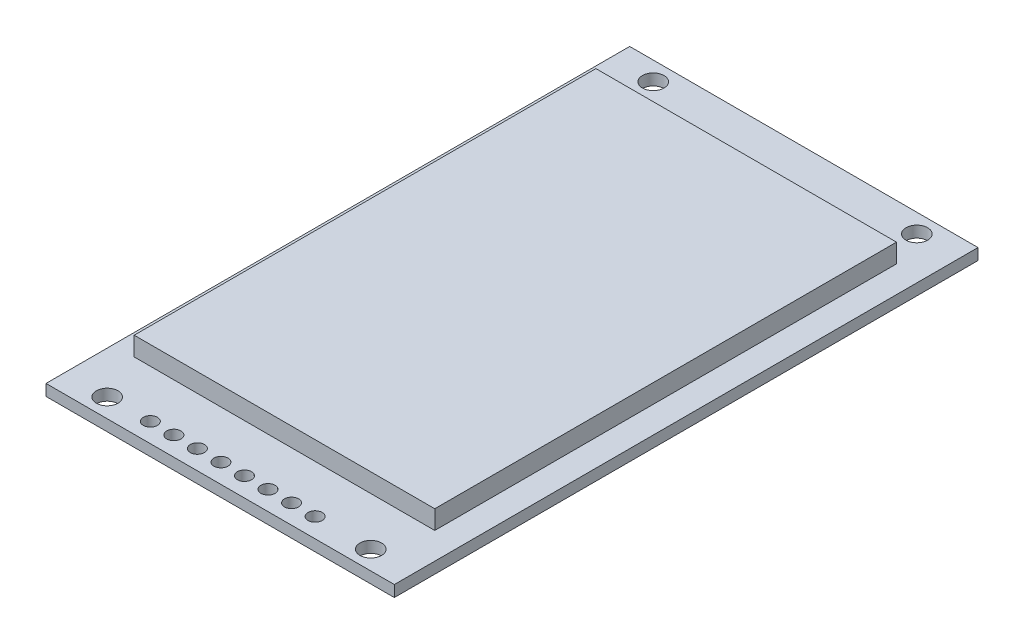
ISO-10303-21;
HEADER;
FILE_DESCRIPTION(('STEP AP214'),'2;1');
FILE_NAME('part.step','',(''),(''),'','','');
FILE_SCHEMA(('AUTOMOTIVE_DESIGN { 1 0 10303 214 1 1 1 1 }'));
ENDSEC;
DATA;
#1=APPLICATION_CONTEXT('core data for automotive mechanical design processes');
#2=APPLICATION_PROTOCOL_DEFINITION('international standard','automotive_design',2000,#1);
#3=PRODUCT_CONTEXT('',#1,'mechanical');
#4=PRODUCT('Part','Part','',(#3));
#5=PRODUCT_RELATED_PRODUCT_CATEGORY('part','',(#4));
#6=PRODUCT_DEFINITION_FORMATION('','',#4);
#7=PRODUCT_DEFINITION_CONTEXT('part definition',#1,'design');
#8=PRODUCT_DEFINITION('design','',#6,#7);
#9=PRODUCT_DEFINITION_SHAPE('','',#8);
#10=(LENGTH_UNIT() NAMED_UNIT(*) SI_UNIT(.MILLI.,.METRE.));
#11=(NAMED_UNIT(*) PLANE_ANGLE_UNIT() SI_UNIT($,.RADIAN.));
#12=(NAMED_UNIT(*) SI_UNIT($,.STERADIAN.) SOLID_ANGLE_UNIT());
#13=UNCERTAINTY_MEASURE_WITH_UNIT(LENGTH_MEASURE(1.E-05),#10,'distance_accuracy_value','');
#14=(GEOMETRIC_REPRESENTATION_CONTEXT(3) GLOBAL_UNCERTAINTY_ASSIGNED_CONTEXT((#13)) GLOBAL_UNIT_ASSIGNED_CONTEXT((#10,
#11,#12)) REPRESENTATION_CONTEXT('',''));
#15=CARTESIAN_POINT('',(0.,0.,0.));
#16=DIRECTION('',(0.,0.,1.));
#17=DIRECTION('',(1.,0.,0.));
#18=AXIS2_PLACEMENT_3D('',#15,#16,#17);
#19=CARTESIAN_POINT('',(0.,1.2,0.));
#20=DIRECTION('',(0.,-1.,0.));
#21=DIRECTION('',(0.,0.,-1.));
#22=AXIS2_PLACEMENT_3D('',#19,#20,#21);
#23=PLANE('',#22);
#24=CARTESIAN_POINT('',(9.03157835822631,1.2,-2.0506883751099));
#25=DIRECTION('',(0.,1.,0.));
#26=DIRECTION('',(0.,0.,1.));
#27=AXIS2_PLACEMENT_3D('',#24,#25,#26);
#28=CIRCLE('',#27,0.75);
#29=CARTESIAN_POINT('',(9.03157835822631,1.2,-1.3006883751099));
#30=VERTEX_POINT('',#29);
#31=EDGE_CURVE('E297',#30,#30,#28,.T.);
#32=ORIENTED_EDGE('',*,*,#31,.F.);
#33=EDGE_LOOP('',(#32));
#34=FACE_BOUND('',#33,.T.);
#35=CARTESIAN_POINT('',(11.5315783582263,1.2,-2.0506883751099));
#36=DIRECTION('',(0.,1.,0.));
#37=DIRECTION('',(0.,0.,1.));
#38=AXIS2_PLACEMENT_3D('',#35,#36,#37);
#39=CIRCLE('',#38,0.75);
#40=CARTESIAN_POINT('',(11.5315783582263,1.2,-1.3006883751099));
#41=VERTEX_POINT('',#40);
#42=EDGE_CURVE('E298',#41,#41,#39,.T.);
#43=ORIENTED_EDGE('',*,*,#42,.F.);
#44=EDGE_LOOP('',(#43));
#45=FACE_BOUND('',#44,.T.);
#46=CARTESIAN_POINT('',(14.0315783582263,1.2,-2.0506883751099));
#47=DIRECTION('',(0.,1.,0.));
#48=DIRECTION('',(0.,0.,1.));
#49=AXIS2_PLACEMENT_3D('',#46,#47,#48);
#50=CIRCLE('',#49,0.749999999999999);
#51=CARTESIAN_POINT('',(14.0315783582263,1.2,-1.30068837510991));
#52=VERTEX_POINT('',#51);
#53=EDGE_CURVE('E307',#52,#52,#50,.T.);
#54=ORIENTED_EDGE('',*,*,#53,.F.);
#55=EDGE_LOOP('',(#54));
#56=FACE_BOUND('',#55,.T.);
#57=CARTESIAN_POINT('',(16.5315783582263,1.2,-2.0506883751099));
#58=DIRECTION('',(0.,1.,0.));
#59=DIRECTION('',(0.,0.,1.));
#60=AXIS2_PLACEMENT_3D('',#57,#58,#59);
#61=CIRCLE('',#60,0.749999999999999);
#62=CARTESIAN_POINT('',(16.5315783582263,1.2,-1.30068837510991));
#63=VERTEX_POINT('',#62);
#64=EDGE_CURVE('E313',#63,#63,#61,.T.);
#65=ORIENTED_EDGE('',*,*,#64,.F.);
#66=EDGE_LOOP('',(#65));
#67=FACE_BOUND('',#66,.T.);
#68=CARTESIAN_POINT('',(19.0315783582263,1.2,-2.0506883751099));
#69=DIRECTION('',(0.,1.,0.));
#70=DIRECTION('',(0.,0.,1.));
#71=AXIS2_PLACEMENT_3D('',#68,#69,#70);
#72=CIRCLE('',#71,0.749999999999999);
#73=CARTESIAN_POINT('',(19.0315783582263,1.2,-1.30068837510991));
#74=VERTEX_POINT('',#73);
#75=EDGE_CURVE('E319',#74,#74,#72,.T.);
#76=ORIENTED_EDGE('',*,*,#75,.F.);
#77=EDGE_LOOP('',(#76));
#78=FACE_BOUND('',#77,.T.);
#79=CARTESIAN_POINT('',(21.5315783582263,1.2,-2.0506883751099));
#80=DIRECTION('',(0.,1.,0.));
#81=DIRECTION('',(0.,0.,1.));
#82=AXIS2_PLACEMENT_3D('',#79,#80,#81);
#83=CIRCLE('',#82,0.750000000000002);
#84=CARTESIAN_POINT('',(21.5315783582263,1.2,-1.3006883751099));
#85=VERTEX_POINT('',#84);
#86=EDGE_CURVE('E325',#85,#85,#83,.T.);
#87=ORIENTED_EDGE('',*,*,#86,.F.);
#88=EDGE_LOOP('',(#87));
#89=FACE_BOUND('',#88,.T.);
#90=CARTESIAN_POINT('',(24.0315783582263,1.2,-2.0506883751099));
#91=DIRECTION('',(0.,1.,0.));
#92=DIRECTION('',(0.,0.,1.));
#93=AXIS2_PLACEMENT_3D('',#90,#91,#92);
#94=CIRCLE('',#93,0.749999999999999);
#95=CARTESIAN_POINT('',(24.0315783582263,1.2,-1.30068837510991));
#96=VERTEX_POINT('',#95);
#97=EDGE_CURVE('E331',#96,#96,#94,.T.);
#98=ORIENTED_EDGE('',*,*,#97,.F.);
#99=EDGE_LOOP('',(#98));
#100=FACE_BOUND('',#99,.T.);
#101=CARTESIAN_POINT('',(26.5315783582263,1.2,-2.0506883751099));
#102=DIRECTION('',(0.,1.,0.));
#103=DIRECTION('',(0.,0.,1.));
#104=AXIS2_PLACEMENT_3D('',#101,#102,#103);
#105=CIRCLE('',#104,0.749999999999999);
#106=CARTESIAN_POINT('',(26.5315783582263,1.2,-1.30068837510991));
#107=VERTEX_POINT('',#106);
#108=EDGE_CURVE('E337',#107,#107,#105,.T.);
#109=ORIENTED_EDGE('',*,*,#108,.F.);
#110=EDGE_LOOP('',(#109));
#111=FACE_BOUND('',#110,.T.);
#112=CARTESIAN_POINT('',(4.50000000000001,1.2,-2.));
#113=DIRECTION('',(0.,1.,0.));
#114=DIRECTION('',(0.,0.,1.));
#115=AXIS2_PLACEMENT_3D('',#112,#113,#114);
#116=CIRCLE('',#115,1.15);
#117=CARTESIAN_POINT('',(4.50000000000001,1.2,-0.850000000000006));
#118=VERTEX_POINT('',#117);
#119=EDGE_CURVE('E127',#118,#118,#116,.T.);
#120=ORIENTED_EDGE('',*,*,#119,.F.);
#121=EDGE_LOOP('',(#120));
#122=FACE_BOUND('',#121,.T.);
#123=CARTESIAN_POINT('',(32.5,1.2,-2.00000000000001));
#124=DIRECTION('',(0.,1.,0.));
#125=DIRECTION('',(0.,0.,1.));
#126=AXIS2_PLACEMENT_3D('',#123,#124,#125);
#127=CIRCLE('',#126,1.15);
#128=CARTESIAN_POINT('',(32.5,1.2,-0.850000000000013));
#129=VERTEX_POINT('',#128);
#130=EDGE_CURVE('E136',#129,#129,#127,.T.);
#131=ORIENTED_EDGE('',*,*,#130,.F.);
#132=EDGE_LOOP('',(#131));
#133=FACE_BOUND('',#132,.T.);
#134=CARTESIAN_POINT('',(4.49999999999999,1.2,-60.));
#135=DIRECTION('',(0.,1.,0.));
#136=DIRECTION('',(0.,0.,1.));
#137=AXIS2_PLACEMENT_3D('',#134,#135,#136);
#138=CIRCLE('',#137,1.15);
#139=CARTESIAN_POINT('',(4.49999999999999,1.2,-58.85));
#140=VERTEX_POINT('',#139);
#141=EDGE_CURVE('E142',#140,#140,#138,.T.);
#142=ORIENTED_EDGE('',*,*,#141,.F.);
#143=EDGE_LOOP('',(#142));
#144=FACE_BOUND('',#143,.T.);
#145=CARTESIAN_POINT('',(32.5,1.2,-60.));
#146=DIRECTION('',(0.,1.,0.));
#147=DIRECTION('',(0.,0.,1.));
#148=AXIS2_PLACEMENT_3D('',#145,#146,#147);
#149=CIRCLE('',#148,1.15);
#150=CARTESIAN_POINT('',(32.5,1.2,-58.85));
#151=VERTEX_POINT('',#150);
#152=EDGE_CURVE('E148',#151,#151,#149,.T.);
#153=ORIENTED_EDGE('',*,*,#152,.F.);
#154=EDGE_LOOP('',(#153));
#155=FACE_BOUND('',#154,.T.);
#156=DIRECTION('',(0.,0.,1.));
#157=VECTOR('',#156,1.);
#158=CARTESIAN_POINT('',(0.,1.2,0.));
#159=LINE('',#158,#157);
#160=CARTESIAN_POINT('',(0.,1.2,-62.));
#161=VERTEX_POINT('',#160);
#162=CARTESIAN_POINT('',(0.,1.2,0.));
#163=VERTEX_POINT('',#162);
#164=EDGE_CURVE('E154',#161,#163,#159,.T.);
#165=ORIENTED_EDGE('',*,*,#164,.T.);
#166=DIRECTION('',(1.,0.,0.));
#167=VECTOR('',#166,1.);
#168=CARTESIAN_POINT('',(0.,1.2,0.));
#169=LINE('',#168,#167);
#170=CARTESIAN_POINT('',(37.,1.2,0.));
#171=VERTEX_POINT('',#170);
#172=EDGE_CURVE('E157',#163,#171,#169,.T.);
#173=ORIENTED_EDGE('',*,*,#172,.T.);
#174=DIRECTION('',(0.,0.,-1.));
#175=VECTOR('',#174,1.);
#176=CARTESIAN_POINT('',(37.,1.2,0.));
#177=LINE('',#176,#175);
#178=CARTESIAN_POINT('',(37.,1.2,-62.));
#179=VERTEX_POINT('',#178);
#180=EDGE_CURVE('E160',#171,#179,#177,.T.);
#181=ORIENTED_EDGE('',*,*,#180,.T.);
#182=DIRECTION('',(-1.,0.,0.));
#183=VECTOR('',#182,1.);
#184=CARTESIAN_POINT('',(0.,1.2,-62.));
#185=LINE('',#184,#183);
#186=EDGE_CURVE('E162',#179,#161,#185,.T.);
#187=ORIENTED_EDGE('',*,*,#186,.T.);
#188=EDGE_LOOP('',(#165,#173,#181,#187));
#189=FACE_BOUND('',#188,.T.);
#190=DIRECTION('',(0.,0.,1.));
#191=VECTOR('',#190,1.);
#192=CARTESIAN_POINT('',(2.24617057200364,1.2,-56.1673902356273));
#193=LINE('',#192,#191);
#194=CARTESIAN_POINT('',(2.24617057200364,1.2,-56.1673902356273));
#195=VERTEX_POINT('',#194);
#196=CARTESIAN_POINT('',(2.24617057200364,1.2,-7.12049327323211));
#197=VERTEX_POINT('',#196);
#198=EDGE_CURVE('E54',#195,#197,#193,.T.);
#199=ORIENTED_EDGE('',*,*,#198,.F.);
#200=DIRECTION('',(-1.,0.,0.));
#201=VECTOR('',#200,1.);
#202=CARTESIAN_POINT('',(2.24617057200364,1.2,-56.1673902356273));
#203=LINE('',#202,#201);
#204=CARTESIAN_POINT('',(34.1749492291427,1.2,-56.1673902356273));
#205=VERTEX_POINT('',#204);
#206=EDGE_CURVE('E58',#205,#195,#203,.T.);
#207=ORIENTED_EDGE('',*,*,#206,.F.);
#208=DIRECTION('',(0.,0.,-1.));
#209=VECTOR('',#208,1.);
#210=CARTESIAN_POINT('',(34.1749492291427,1.2,-56.1673902356273));
#211=LINE('',#210,#209);
#212=CARTESIAN_POINT('',(34.1749492291427,1.2,-7.12049327323211));
#213=VERTEX_POINT('',#212);
#214=EDGE_CURVE('E349',#213,#205,#211,.T.);
#215=ORIENTED_EDGE('',*,*,#214,.F.);
#216=DIRECTION('',(1.,0.,0.));
#217=VECTOR('',#216,1.);
#218=CARTESIAN_POINT('',(2.24617057200364,1.2,-7.12049327323211));
#219=LINE('',#218,#217);
#220=EDGE_CURVE('E347',#197,#213,#219,.T.);
#221=ORIENTED_EDGE('',*,*,#220,.F.);
#222=EDGE_LOOP('',(#199,#207,#215,#221));
#223=FACE_BOUND('',#222,.T.);
#224=ADVANCED_FACE('F39',(#34,#45,#56,#67,#78,#89,#100,#111,#122,#133,#144,#155,#189,#223),#23,.F.);
#225=CARTESIAN_POINT('',(0.,0.,0.));
#226=DIRECTION('',(0.,-1.,0.));
#227=DIRECTION('',(0.,0.,-1.));
#228=AXIS2_PLACEMENT_3D('',#225,#226,#227);
#229=PLANE('',#228);
#230=CARTESIAN_POINT('',(9.03157835822631,0.,-2.0506883751099));
#231=DIRECTION('',(0.,1.,0.));
#232=DIRECTION('',(0.,0.,1.));
#233=AXIS2_PLACEMENT_3D('',#230,#231,#232);
#234=CIRCLE('',#233,0.75);
#235=CARTESIAN_POINT('',(9.03157835822631,0.,-1.3006883751099));
#236=VERTEX_POINT('',#235);
#237=EDGE_CURVE('E295',#236,#236,#234,.T.);
#238=ORIENTED_EDGE('',*,*,#237,.T.);
#239=EDGE_LOOP('',(#238));
#240=FACE_BOUND('',#239,.T.);
#241=CARTESIAN_POINT('',(11.5315783582263,0.,-2.0506883751099));
#242=DIRECTION('',(0.,1.,0.));
#243=DIRECTION('',(0.,0.,1.));
#244=AXIS2_PLACEMENT_3D('',#241,#242,#243);
#245=CIRCLE('',#244,0.75);
#246=CARTESIAN_POINT('',(11.5315783582263,0.,-1.3006883751099));
#247=VERTEX_POINT('',#246);
#248=EDGE_CURVE('E302',#247,#247,#245,.T.);
#249=ORIENTED_EDGE('',*,*,#248,.T.);
#250=EDGE_LOOP('',(#249));
#251=FACE_BOUND('',#250,.T.);
#252=CARTESIAN_POINT('',(14.0315783582263,0.,-2.0506883751099));
#253=DIRECTION('',(0.,1.,0.));
#254=DIRECTION('',(0.,0.,1.));
#255=AXIS2_PLACEMENT_3D('',#252,#253,#254);
#256=CIRCLE('',#255,0.749999999999999);
#257=CARTESIAN_POINT('',(14.0315783582263,0.,-1.30068837510991));
#258=VERTEX_POINT('',#257);
#259=EDGE_CURVE('E310',#258,#258,#256,.T.);
#260=ORIENTED_EDGE('',*,*,#259,.T.);
#261=EDGE_LOOP('',(#260));
#262=FACE_BOUND('',#261,.T.);
#263=CARTESIAN_POINT('',(16.5315783582263,0.,-2.0506883751099));
#264=DIRECTION('',(0.,1.,0.));
#265=DIRECTION('',(0.,0.,1.));
#266=AXIS2_PLACEMENT_3D('',#263,#264,#265);
#267=CIRCLE('',#266,0.749999999999999);
#268=CARTESIAN_POINT('',(16.5315783582263,0.,-1.30068837510991));
#269=VERTEX_POINT('',#268);
#270=EDGE_CURVE('E316',#269,#269,#267,.T.);
#271=ORIENTED_EDGE('',*,*,#270,.T.);
#272=EDGE_LOOP('',(#271));
#273=FACE_BOUND('',#272,.T.);
#274=CARTESIAN_POINT('',(19.0315783582263,0.,-2.0506883751099));
#275=DIRECTION('',(0.,1.,0.));
#276=DIRECTION('',(0.,0.,1.));
#277=AXIS2_PLACEMENT_3D('',#274,#275,#276);
#278=CIRCLE('',#277,0.749999999999999);
#279=CARTESIAN_POINT('',(19.0315783582263,0.,-1.30068837510991));
#280=VERTEX_POINT('',#279);
#281=EDGE_CURVE('E322',#280,#280,#278,.T.);
#282=ORIENTED_EDGE('',*,*,#281,.T.);
#283=EDGE_LOOP('',(#282));
#284=FACE_BOUND('',#283,.T.);
#285=CARTESIAN_POINT('',(21.5315783582263,0.,-2.0506883751099));
#286=DIRECTION('',(0.,1.,0.));
#287=DIRECTION('',(0.,0.,1.));
#288=AXIS2_PLACEMENT_3D('',#285,#286,#287);
#289=CIRCLE('',#288,0.750000000000002);
#290=CARTESIAN_POINT('',(21.5315783582263,0.,-1.3006883751099));
#291=VERTEX_POINT('',#290);
#292=EDGE_CURVE('E328',#291,#291,#289,.T.);
#293=ORIENTED_EDGE('',*,*,#292,.T.);
#294=EDGE_LOOP('',(#293));
#295=FACE_BOUND('',#294,.T.);
#296=CARTESIAN_POINT('',(24.0315783582263,0.,-2.0506883751099));
#297=DIRECTION('',(0.,1.,0.));
#298=DIRECTION('',(0.,0.,1.));
#299=AXIS2_PLACEMENT_3D('',#296,#297,#298);
#300=CIRCLE('',#299,0.749999999999999);
#301=CARTESIAN_POINT('',(24.0315783582263,0.,-1.30068837510991));
#302=VERTEX_POINT('',#301);
#303=EDGE_CURVE('E334',#302,#302,#300,.T.);
#304=ORIENTED_EDGE('',*,*,#303,.T.);
#305=EDGE_LOOP('',(#304));
#306=FACE_BOUND('',#305,.T.);
#307=CARTESIAN_POINT('',(26.5315783582263,0.,-2.0506883751099));
#308=DIRECTION('',(0.,1.,0.));
#309=DIRECTION('',(0.,0.,1.));
#310=AXIS2_PLACEMENT_3D('',#307,#308,#309);
#311=CIRCLE('',#310,0.749999999999999);
#312=CARTESIAN_POINT('',(26.5315783582263,0.,-1.30068837510991));
#313=VERTEX_POINT('',#312);
#314=EDGE_CURVE('E340',#313,#313,#311,.T.);
#315=ORIENTED_EDGE('',*,*,#314,.T.);
#316=EDGE_LOOP('',(#315));
#317=FACE_BOUND('',#316,.T.);
#318=CARTESIAN_POINT('',(32.5,0.,-2.00000000000001));
#319=DIRECTION('',(0.,1.,0.));
#320=DIRECTION('',(0.,0.,1.));
#321=AXIS2_PLACEMENT_3D('',#318,#319,#320);
#322=CIRCLE('',#321,1.15);
#323=CARTESIAN_POINT('',(32.5,0.,-0.850000000000013));
#324=VERTEX_POINT('',#323);
#325=EDGE_CURVE('E134',#324,#324,#322,.T.);
#326=ORIENTED_EDGE('',*,*,#325,.T.);
#327=EDGE_LOOP('',(#326));
#328=FACE_BOUND('',#327,.T.);
#329=CARTESIAN_POINT('',(32.5,0.,-60.));
#330=DIRECTION('',(0.,1.,0.));
#331=DIRECTION('',(0.,0.,1.));
#332=AXIS2_PLACEMENT_3D('',#329,#330,#331);
#333=CIRCLE('',#332,1.15);
#334=CARTESIAN_POINT('',(32.5,0.,-58.85));
#335=VERTEX_POINT('',#334);
#336=EDGE_CURVE('E145',#335,#335,#333,.T.);
#337=ORIENTED_EDGE('',*,*,#336,.T.);
#338=EDGE_LOOP('',(#337));
#339=FACE_BOUND('',#338,.T.);
#340=DIRECTION('',(0.,0.,1.));
#341=VECTOR('',#340,1.);
#342=CARTESIAN_POINT('',(0.,0.,0.));
#343=LINE('',#342,#341);
#344=CARTESIAN_POINT('',(0.,0.,-62.));
#345=VERTEX_POINT('',#344);
#346=CARTESIAN_POINT('',(0.,0.,0.));
#347=VERTEX_POINT('',#346);
#348=EDGE_CURVE('E151',#345,#347,#343,.T.);
#349=ORIENTED_EDGE('',*,*,#348,.F.);
#350=DIRECTION('',(-1.,0.,0.));
#351=VECTOR('',#350,1.);
#352=CARTESIAN_POINT('',(0.,0.,-62.));
#353=LINE('',#352,#351);
#354=CARTESIAN_POINT('',(37.,0.,-62.));
#355=VERTEX_POINT('',#354);
#356=EDGE_CURVE('E158',#355,#345,#353,.T.);
#357=ORIENTED_EDGE('',*,*,#356,.F.);
#358=DIRECTION('',(0.,0.,-1.));
#359=VECTOR('',#358,1.);
#360=CARTESIAN_POINT('',(37.,0.,0.));
#361=LINE('',#360,#359);
#362=CARTESIAN_POINT('',(37.,0.,0.));
#363=VERTEX_POINT('',#362);
#364=EDGE_CURVE('E169',#363,#355,#361,.T.);
#365=ORIENTED_EDGE('',*,*,#364,.F.);
#366=DIRECTION('',(1.,0.,0.));
#367=VECTOR('',#366,1.);
#368=CARTESIAN_POINT('',(0.,0.,0.));
#369=LINE('',#368,#367);
#370=EDGE_CURVE('E167',#347,#363,#369,.T.);
#371=ORIENTED_EDGE('',*,*,#370,.F.);
#372=EDGE_LOOP('',(#349,#357,#365,#371));
#373=FACE_BOUND('',#372,.T.);
#374=CARTESIAN_POINT('',(4.49999999999999,0.,-60.));
#375=DIRECTION('',(0.,1.,0.));
#376=DIRECTION('',(0.,0.,1.));
#377=AXIS2_PLACEMENT_3D('',#374,#375,#376);
#378=CIRCLE('',#377,1.15);
#379=CARTESIAN_POINT('',(4.49999999999999,0.,-58.85));
#380=VERTEX_POINT('',#379);
#381=EDGE_CURVE('E139',#380,#380,#378,.T.);
#382=ORIENTED_EDGE('',*,*,#381,.T.);
#383=EDGE_LOOP('',(#382));
#384=FACE_BOUND('',#383,.T.);
#385=CARTESIAN_POINT('',(4.50000000000001,0.,-2.));
#386=DIRECTION('',(0.,1.,0.));
#387=DIRECTION('',(0.,0.,1.));
#388=AXIS2_PLACEMENT_3D('',#385,#386,#387);
#389=CIRCLE('',#388,1.15);
#390=CARTESIAN_POINT('',(4.50000000000001,0.,-0.850000000000006));
#391=VERTEX_POINT('',#390);
#392=EDGE_CURVE('E124',#391,#391,#389,.T.);
#393=ORIENTED_EDGE('',*,*,#392,.T.);
#394=EDGE_LOOP('',(#393));
#395=FACE_BOUND('',#394,.T.);
#396=ADVANCED_FACE('F187',(#240,#251,#262,#273,#284,#295,#306,#317,#328,#339,#373,#384,#395),
#229,.T.);
#397=CARTESIAN_POINT('',(0.,1.2,0.));
#398=DIRECTION('',(1.,0.,0.));
#399=DIRECTION('',(0.,0.,-1.));
#400=AXIS2_PLACEMENT_3D('',#397,#398,#399);
#401=PLANE('',#400);
#402=ORIENTED_EDGE('',*,*,#348,.T.);
#403=DIRECTION('',(0.,-1.,0.));
#404=VECTOR('',#403,1.);
#405=CARTESIAN_POINT('',(0.,1.2,0.));
#406=LINE('',#405,#404);
#407=EDGE_CURVE('E11',#163,#347,#406,.T.);
#408=ORIENTED_EDGE('',*,*,#407,.F.);
#409=ORIENTED_EDGE('',*,*,#164,.F.);
#410=DIRECTION('',(0.,-1.,0.));
#411=VECTOR('',#410,1.);
#412=CARTESIAN_POINT('',(0.,1.2,-62.));
#413=LINE('',#412,#411);
#414=EDGE_CURVE('E164',#161,#345,#413,.T.);
#415=ORIENTED_EDGE('',*,*,#414,.T.);
#416=EDGE_LOOP('',(#402,#408,#409,#415));
#417=FACE_BOUND('',#416,.T.);
#418=ADVANCED_FACE('F41',(#417),#401,.F.);
#419=CARTESIAN_POINT('',(0.,1.2,0.));
#420=DIRECTION('',(0.,0.,-1.));
#421=DIRECTION('',(-1.,0.,0.));
#422=AXIS2_PLACEMENT_3D('',#419,#420,#421);
#423=PLANE('',#422);
#424=ORIENTED_EDGE('',*,*,#370,.T.);
#425=DIRECTION('',(0.,-1.,0.));
#426=VECTOR('',#425,1.);
#427=CARTESIAN_POINT('',(37.,1.2,0.));
#428=LINE('',#427,#426);
#429=EDGE_CURVE('E47',#171,#363,#428,.T.);
#430=ORIENTED_EDGE('',*,*,#429,.F.);
#431=ORIENTED_EDGE('',*,*,#172,.F.);
#432=ORIENTED_EDGE('',*,*,#407,.T.);
#433=EDGE_LOOP('',(#424,#430,#431,#432));
#434=FACE_BOUND('',#433,.T.);
#435=ADVANCED_FACE('F197',(#434),#423,.F.);
#436=CARTESIAN_POINT('',(37.,1.2,0.));
#437=DIRECTION('',(-1.,0.,0.));
#438=DIRECTION('',(0.,0.,1.));
#439=AXIS2_PLACEMENT_3D('',#436,#437,#438);
#440=PLANE('',#439);
#441=ORIENTED_EDGE('',*,*,#364,.T.);
#442=DIRECTION('',(0.,-1.,0.));
#443=VECTOR('',#442,1.);
#444=CARTESIAN_POINT('',(37.,1.2,-62.));
#445=LINE('',#444,#443);
#446=EDGE_CURVE('E174',#179,#355,#445,.T.);
#447=ORIENTED_EDGE('',*,*,#446,.F.);
#448=ORIENTED_EDGE('',*,*,#180,.F.);
#449=ORIENTED_EDGE('',*,*,#429,.T.);
#450=EDGE_LOOP('',(#441,#447,#448,#449));
#451=FACE_BOUND('',#450,.T.);
#452=ADVANCED_FACE('F181',(#451),#440,.F.);
#453=CARTESIAN_POINT('',(0.,1.2,-62.));
#454=DIRECTION('',(0.,0.,1.));
#455=DIRECTION('',(1.,0.,0.));
#456=AXIS2_PLACEMENT_3D('',#453,#454,#455);
#457=PLANE('',#456);
#458=ORIENTED_EDGE('',*,*,#356,.T.);
#459=ORIENTED_EDGE('',*,*,#414,.F.);
#460=ORIENTED_EDGE('',*,*,#186,.F.);
#461=ORIENTED_EDGE('',*,*,#446,.T.);
#462=EDGE_LOOP('',(#458,#459,#460,#461));
#463=FACE_BOUND('',#462,.T.);
#464=ADVANCED_FACE('F191',(#463),#457,.F.);
#465=CARTESIAN_POINT('',(32.5,1.2,-60.));
#466=DIRECTION('',(0.,-1.,0.));
#467=DIRECTION('',(0.,0.,-1.));
#468=AXIS2_PLACEMENT_3D('',#465,#466,#467);
#469=CYLINDRICAL_SURFACE('',#468,1.15);
#470=ORIENTED_EDGE('',*,*,#152,.T.);
#471=EDGE_LOOP('',(#470));
#472=FACE_BOUND('',#471,.T.);
#473=ORIENTED_EDGE('',*,*,#336,.F.);
#474=EDGE_LOOP('',(#473));
#475=FACE_BOUND('',#474,.T.);
#476=ADVANCED_FACE('F215',(#472,#475),#469,.F.);
#477=CARTESIAN_POINT('',(4.49999999999999,1.2,-60.));
#478=DIRECTION('',(0.,-1.,0.));
#479=DIRECTION('',(0.,0.,-1.));
#480=AXIS2_PLACEMENT_3D('',#477,#478,#479);
#481=CYLINDRICAL_SURFACE('',#480,1.15);
#482=ORIENTED_EDGE('',*,*,#141,.T.);
#483=EDGE_LOOP('',(#482));
#484=FACE_BOUND('',#483,.T.);
#485=ORIENTED_EDGE('',*,*,#381,.F.);
#486=EDGE_LOOP('',(#485));
#487=FACE_BOUND('',#486,.T.);
#488=ADVANCED_FACE('F222',(#484,#487),#481,.F.);
#489=CARTESIAN_POINT('',(32.5,1.2,-2.00000000000001));
#490=DIRECTION('',(0.,-1.,0.));
#491=DIRECTION('',(0.,0.,-1.));
#492=AXIS2_PLACEMENT_3D('',#489,#490,#491);
#493=CYLINDRICAL_SURFACE('',#492,1.15);
#494=ORIENTED_EDGE('',*,*,#130,.T.);
#495=EDGE_LOOP('',(#494));
#496=FACE_BOUND('',#495,.T.);
#497=ORIENTED_EDGE('',*,*,#325,.F.);
#498=EDGE_LOOP('',(#497));
#499=FACE_BOUND('',#498,.T.);
#500=ADVANCED_FACE('F227',(#496,#499),#493,.F.);
#501=CARTESIAN_POINT('',(4.50000000000001,1.2,-2.));
#502=DIRECTION('',(0.,-1.,0.));
#503=DIRECTION('',(0.,0.,-1.));
#504=AXIS2_PLACEMENT_3D('',#501,#502,#503);
#505=CYLINDRICAL_SURFACE('',#504,1.15);
#506=ORIENTED_EDGE('',*,*,#119,.T.);
#507=EDGE_LOOP('',(#506));
#508=FACE_BOUND('',#507,.T.);
#509=ORIENTED_EDGE('',*,*,#392,.F.);
#510=EDGE_LOOP('',(#509));
#511=FACE_BOUND('',#510,.T.);
#512=ADVANCED_FACE('F237',(#508,#511),#505,.F.);
#513=CARTESIAN_POINT('',(2.24617057200364,3.2,-56.1673902356273));
#514=DIRECTION('',(1.,0.,0.));
#515=DIRECTION('',(0.,0.,-1.));
#516=AXIS2_PLACEMENT_3D('',#513,#514,#515);
#517=PLANE('',#516);
#518=ORIENTED_EDGE('',*,*,#198,.T.);
#519=DIRECTION('',(0.,-1.,0.));
#520=VECTOR('',#519,1.);
#521=CARTESIAN_POINT('',(2.24617057200364,3.2,-7.12049327323211));
#522=LINE('',#521,#520);
#523=CARTESIAN_POINT('',(2.24617057200364,3.2,-7.12049327323211));
#524=VERTEX_POINT('',#523);
#525=EDGE_CURVE('E107',#524,#197,#522,.T.);
#526=ORIENTED_EDGE('',*,*,#525,.F.);
#527=DIRECTION('',(0.,0.,1.));
#528=VECTOR('',#527,1.);
#529=CARTESIAN_POINT('',(2.24617057200364,3.2,-56.1673902356273));
#530=LINE('',#529,#528);
#531=CARTESIAN_POINT('',(2.24617057200364,3.2,-56.1673902356273));
#532=VERTEX_POINT('',#531);
#533=EDGE_CURVE('E113',#532,#524,#530,.T.);
#534=ORIENTED_EDGE('',*,*,#533,.F.);
#535=DIRECTION('',(0.,-1.,0.));
#536=VECTOR('',#535,1.);
#537=CARTESIAN_POINT('',(2.24617057200364,3.2,-56.1673902356273));
#538=LINE('',#537,#536);
#539=EDGE_CURVE('E345',#532,#195,#538,.T.);
#540=ORIENTED_EDGE('',*,*,#539,.T.);
#541=EDGE_LOOP('',(#518,#526,#534,#540));
#542=FACE_BOUND('',#541,.T.);
#543=ADVANCED_FACE('F123',(#542),#517,.F.);
#544=CARTESIAN_POINT('',(2.24617057200364,3.2,-7.12049327323211));
#545=DIRECTION('',(0.,0.,-1.));
#546=DIRECTION('',(-1.,0.,0.));
#547=AXIS2_PLACEMENT_3D('',#544,#545,#546);
#548=PLANE('',#547);
#549=ORIENTED_EDGE('',*,*,#220,.T.);
#550=DIRECTION('',(0.,-1.,0.));
#551=VECTOR('',#550,1.);
#552=CARTESIAN_POINT('',(34.1749492291427,3.2,-7.12049327323211));
#553=LINE('',#552,#551);
#554=CARTESIAN_POINT('',(34.1749492291427,3.2,-7.12049327323211));
#555=VERTEX_POINT('',#554);
#556=EDGE_CURVE('E109',#555,#213,#553,.T.);
#557=ORIENTED_EDGE('',*,*,#556,.F.);
#558=DIRECTION('',(1.,0.,0.));
#559=VECTOR('',#558,1.);
#560=CARTESIAN_POINT('',(2.24617057200364,3.2,-7.12049327323211));
#561=LINE('',#560,#559);
#562=EDGE_CURVE('E102',#524,#555,#561,.T.);
#563=ORIENTED_EDGE('',*,*,#562,.F.);
#564=ORIENTED_EDGE('',*,*,#525,.T.);
#565=EDGE_LOOP('',(#549,#557,#563,#564));
#566=FACE_BOUND('',#565,.T.);
#567=ADVANCED_FACE('F105',(#566),#548,.F.);
#568=CARTESIAN_POINT('',(34.1749492291427,3.2,-56.1673902356273));
#569=DIRECTION('',(-1.,0.,0.));
#570=DIRECTION('',(0.,0.,1.));
#571=AXIS2_PLACEMENT_3D('',#568,#569,#570);
#572=PLANE('',#571);
#573=ORIENTED_EDGE('',*,*,#214,.T.);
#574=DIRECTION('',(0.,-1.,0.));
#575=VECTOR('',#574,1.);
#576=CARTESIAN_POINT('',(34.1749492291427,3.2,-56.1673902356273));
#577=LINE('',#576,#575);
#578=CARTESIAN_POINT('',(34.1749492291427,3.2,-56.1673902356273));
#579=VERTEX_POINT('',#578);
#580=EDGE_CURVE('E129',#579,#205,#577,.T.);
#581=ORIENTED_EDGE('',*,*,#580,.F.);
#582=DIRECTION('',(0.,0.,-1.));
#583=VECTOR('',#582,1.);
#584=CARTESIAN_POINT('',(34.1749492291427,3.2,-56.1673902356273));
#585=LINE('',#584,#583);
#586=EDGE_CURVE('E112',#555,#579,#585,.T.);
#587=ORIENTED_EDGE('',*,*,#586,.F.);
#588=ORIENTED_EDGE('',*,*,#556,.T.);
#589=EDGE_LOOP('',(#573,#581,#587,#588));
#590=FACE_BOUND('',#589,.T.);
#591=ADVANCED_FACE('F249',(#590),#572,.F.);
#592=CARTESIAN_POINT('',(2.24617057200364,3.2,-56.1673902356273));
#593=DIRECTION('',(0.,0.,1.));
#594=DIRECTION('',(1.,0.,0.));
#595=AXIS2_PLACEMENT_3D('',#592,#593,#594);
#596=PLANE('',#595);
#597=ORIENTED_EDGE('',*,*,#206,.T.);
#598=ORIENTED_EDGE('',*,*,#539,.F.);
#599=DIRECTION('',(-1.,0.,0.));
#600=VECTOR('',#599,1.);
#601=CARTESIAN_POINT('',(2.24617057200364,3.2,-56.1673902356273));
#602=LINE('',#601,#600);
#603=EDGE_CURVE('E118',#579,#532,#602,.T.);
#604=ORIENTED_EDGE('',*,*,#603,.F.);
#605=ORIENTED_EDGE('',*,*,#580,.T.);
#606=EDGE_LOOP('',(#597,#598,#604,#605));
#607=FACE_BOUND('',#606,.T.);
#608=ADVANCED_FACE('F252',(#607),#596,.F.);
#609=CARTESIAN_POINT('',(0.,3.2,0.));
#610=DIRECTION('',(0.,1.,0.));
#611=DIRECTION('',(0.,0.,1.));
#612=AXIS2_PLACEMENT_3D('',#609,#610,#611);
#613=PLANE('',#612);
#614=ORIENTED_EDGE('',*,*,#533,.T.);
#615=ORIENTED_EDGE('',*,*,#562,.T.);
#616=ORIENTED_EDGE('',*,*,#586,.T.);
#617=ORIENTED_EDGE('',*,*,#603,.T.);
#618=EDGE_LOOP('',(#614,#615,#616,#617));
#619=FACE_BOUND('',#618,.T.);
#620=ADVANCED_FACE('F116',(#619),#613,.T.);
#621=CARTESIAN_POINT('',(26.5315783582263,0.,-2.0506883751099));
#622=DIRECTION('',(0.,1.,0.));
#623=DIRECTION('',(0.,0.,1.));
#624=AXIS2_PLACEMENT_3D('',#621,#622,#623);
#625=CYLINDRICAL_SURFACE('',#624,0.749999999999999);
#626=ORIENTED_EDGE('',*,*,#314,.F.);
#627=EDGE_LOOP('',(#626));
#628=FACE_BOUND('',#627,.T.);
#629=ORIENTED_EDGE('',*,*,#108,.T.);
#630=EDGE_LOOP('',(#629));
#631=FACE_BOUND('',#630,.T.);
#632=ADVANCED_FACE('F259',(#628,#631),#625,.F.);
#633=CARTESIAN_POINT('',(24.0315783582263,0.,-2.0506883751099));
#634=DIRECTION('',(0.,1.,0.));
#635=DIRECTION('',(0.,0.,1.));
#636=AXIS2_PLACEMENT_3D('',#633,#634,#635);
#637=CYLINDRICAL_SURFACE('',#636,0.749999999999999);
#638=ORIENTED_EDGE('',*,*,#303,.F.);
#639=EDGE_LOOP('',(#638));
#640=FACE_BOUND('',#639,.T.);
#641=ORIENTED_EDGE('',*,*,#97,.T.);
#642=EDGE_LOOP('',(#641));
#643=FACE_BOUND('',#642,.T.);
#644=ADVANCED_FACE('F262',(#640,#643),#637,.F.);
#645=CARTESIAN_POINT('',(21.5315783582263,0.,-2.0506883751099));
#646=DIRECTION('',(0.,1.,0.));
#647=DIRECTION('',(0.,0.,1.));
#648=AXIS2_PLACEMENT_3D('',#645,#646,#647);
#649=CYLINDRICAL_SURFACE('',#648,0.750000000000002);
#650=ORIENTED_EDGE('',*,*,#292,.F.);
#651=EDGE_LOOP('',(#650));
#652=FACE_BOUND('',#651,.T.);
#653=ORIENTED_EDGE('',*,*,#86,.T.);
#654=EDGE_LOOP('',(#653));
#655=FACE_BOUND('',#654,.T.);
#656=ADVANCED_FACE('F266',(#652,#655),#649,.F.);
#657=CARTESIAN_POINT('',(19.0315783582263,0.,-2.0506883751099));
#658=DIRECTION('',(0.,1.,0.));
#659=DIRECTION('',(0.,0.,1.));
#660=AXIS2_PLACEMENT_3D('',#657,#658,#659);
#661=CYLINDRICAL_SURFACE('',#660,0.749999999999999);
#662=ORIENTED_EDGE('',*,*,#281,.F.);
#663=EDGE_LOOP('',(#662));
#664=FACE_BOUND('',#663,.T.);
#665=ORIENTED_EDGE('',*,*,#75,.T.);
#666=EDGE_LOOP('',(#665));
#667=FACE_BOUND('',#666,.T.);
#668=ADVANCED_FACE('F270',(#664,#667),#661,.F.);
#669=CARTESIAN_POINT('',(16.5315783582263,0.,-2.0506883751099));
#670=DIRECTION('',(0.,1.,0.));
#671=DIRECTION('',(0.,0.,1.));
#672=AXIS2_PLACEMENT_3D('',#669,#670,#671);
#673=CYLINDRICAL_SURFACE('',#672,0.749999999999999);
#674=ORIENTED_EDGE('',*,*,#270,.F.);
#675=EDGE_LOOP('',(#674));
#676=FACE_BOUND('',#675,.T.);
#677=ORIENTED_EDGE('',*,*,#64,.T.);
#678=EDGE_LOOP('',(#677));
#679=FACE_BOUND('',#678,.T.);
#680=ADVANCED_FACE('F274',(#676,#679),#673,.F.);
#681=CARTESIAN_POINT('',(14.0315783582263,0.,-2.0506883751099));
#682=DIRECTION('',(0.,1.,0.));
#683=DIRECTION('',(0.,0.,1.));
#684=AXIS2_PLACEMENT_3D('',#681,#682,#683);
#685=CYLINDRICAL_SURFACE('',#684,0.749999999999999);
#686=ORIENTED_EDGE('',*,*,#259,.F.);
#687=EDGE_LOOP('',(#686));
#688=FACE_BOUND('',#687,.T.);
#689=ORIENTED_EDGE('',*,*,#53,.T.);
#690=EDGE_LOOP('',(#689));
#691=FACE_BOUND('',#690,.T.);
#692=ADVANCED_FACE('F278',(#688,#691),#685,.F.);
#693=CARTESIAN_POINT('',(11.5315783582263,0.,-2.0506883751099));
#694=DIRECTION('',(0.,1.,0.));
#695=DIRECTION('',(0.,0.,1.));
#696=AXIS2_PLACEMENT_3D('',#693,#694,#695);
#697=CYLINDRICAL_SURFACE('',#696,0.75);
#698=ORIENTED_EDGE('',*,*,#248,.F.);
#699=EDGE_LOOP('',(#698));
#700=FACE_BOUND('',#699,.T.);
#701=ORIENTED_EDGE('',*,*,#42,.T.);
#702=EDGE_LOOP('',(#701));
#703=FACE_BOUND('',#702,.T.);
#704=ADVANCED_FACE('F282',(#700,#703),#697,.F.);
#705=CARTESIAN_POINT('',(9.03157835822631,0.,-2.0506883751099));
#706=DIRECTION('',(0.,1.,0.));
#707=DIRECTION('',(0.,0.,1.));
#708=AXIS2_PLACEMENT_3D('',#705,#706,#707);
#709=CYLINDRICAL_SURFACE('',#708,0.75);
#710=ORIENTED_EDGE('',*,*,#237,.F.);
#711=EDGE_LOOP('',(#710));
#712=FACE_BOUND('',#711,.T.);
#713=ORIENTED_EDGE('',*,*,#31,.T.);
#714=EDGE_LOOP('',(#713));
#715=FACE_BOUND('',#714,.T.);
#716=ADVANCED_FACE('F286',(#712,#715),#709,.F.);
#717=CLOSED_SHELL('',(#224,#396,#418,#435,#452,#464,#476,#488,#500,#512,#543,#567,#591,#608,
#620,#632,#644,#656,#668,#680,#692,#704,#716));
#718=MANIFOLD_SOLID_BREP('B2',#717);
#719=ADVANCED_BREP_SHAPE_REPRESENTATION('',(#18,#718),#14);
#720=SHAPE_DEFINITION_REPRESENTATION(#9,#719);
ENDSEC;
END-ISO-10303-21;
